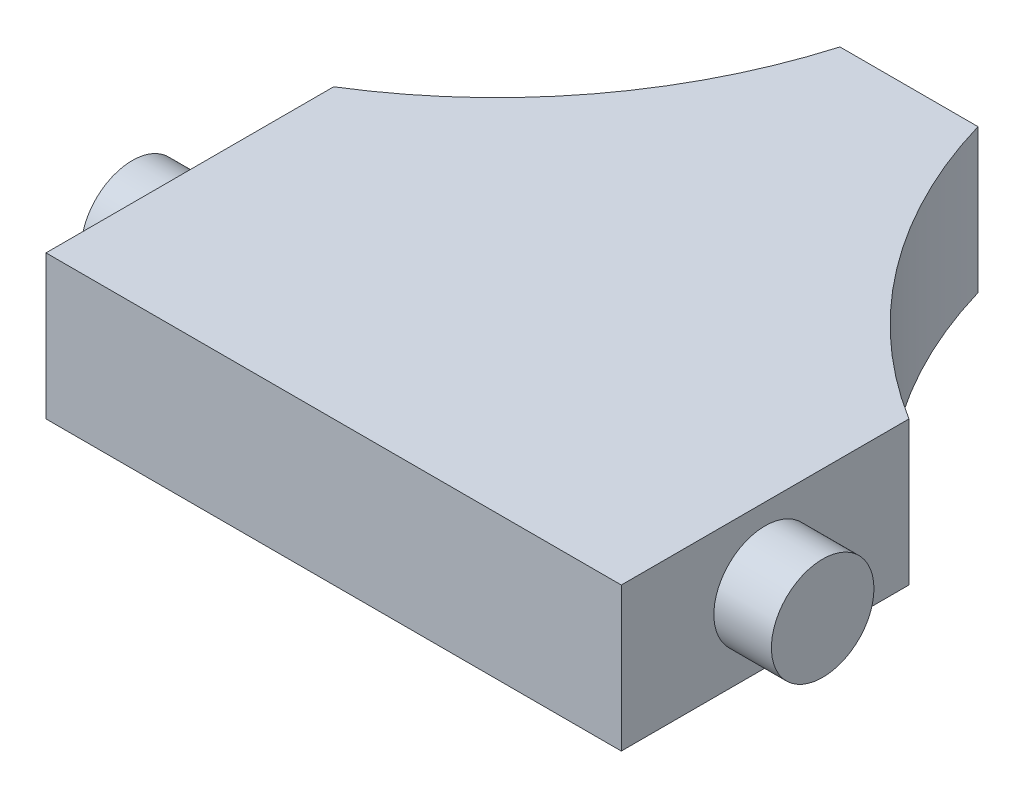
ISO-10303-21;
HEADER;
FILE_DESCRIPTION(('STEP AP214'),'2;1');
FILE_NAME('part.step','',(''),(''),'','','');
FILE_SCHEMA(('AUTOMOTIVE_DESIGN { 1 0 10303 214 1 1 1 1 }'));
ENDSEC;
DATA;
#1=APPLICATION_CONTEXT('core data for automotive mechanical design processes');
#2=APPLICATION_PROTOCOL_DEFINITION('international standard','automotive_design',2000,#1);
#3=PRODUCT_CONTEXT('',#1,'mechanical');
#4=PRODUCT('Part','Part','',(#3));
#5=PRODUCT_RELATED_PRODUCT_CATEGORY('part','',(#4));
#6=PRODUCT_DEFINITION_FORMATION('','',#4);
#7=PRODUCT_DEFINITION_CONTEXT('part definition',#1,'design');
#8=PRODUCT_DEFINITION('design','',#6,#7);
#9=PRODUCT_DEFINITION_SHAPE('','',#8);
#10=(LENGTH_UNIT() NAMED_UNIT(*) SI_UNIT(.MILLI.,.METRE.));
#11=(NAMED_UNIT(*) PLANE_ANGLE_UNIT() SI_UNIT($,.RADIAN.));
#12=(NAMED_UNIT(*) SI_UNIT($,.STERADIAN.) SOLID_ANGLE_UNIT());
#13=UNCERTAINTY_MEASURE_WITH_UNIT(LENGTH_MEASURE(1.E-05),#10,'distance_accuracy_value','');
#14=(GEOMETRIC_REPRESENTATION_CONTEXT(3) GLOBAL_UNCERTAINTY_ASSIGNED_CONTEXT((#13)) GLOBAL_UNIT_ASSIGNED_CONTEXT((#10,
#11,#12)) REPRESENTATION_CONTEXT('',''));
#15=CARTESIAN_POINT('',(0.,0.,0.));
#16=DIRECTION('',(0.,0.,1.));
#17=DIRECTION('',(1.,0.,0.));
#18=AXIS2_PLACEMENT_3D('',#15,#16,#17);
#19=CARTESIAN_POINT('',(96.2895239445508,25.,-74.6200381978586));
#20=DIRECTION('',(0.,-1.,0.));
#21=DIRECTION('',(0.,0.,-1.));
#22=AXIS2_PLACEMENT_3D('',#19,#20,#21);
#23=CYLINDRICAL_SURFACE('',#22,87.8115603304201);
#24=CARTESIAN_POINT('',(96.2895239445508,0.,-74.6200381978586));
#25=DIRECTION('',(0.,1.,0.));
#26=DIRECTION('',(0.,0.,1.));
#27=AXIS2_PLACEMENT_3D('',#24,#25,#26);
#28=CIRCLE('',#27,87.8115603304201);
#29=CARTESIAN_POINT('',(50.,0.,0.));
#30=VERTEX_POINT('',#29);
#31=CARTESIAN_POINT('',(12.,0.,-50.));
#32=VERTEX_POINT('',#31);
#33=EDGE_CURVE('E133',#30,#32,#28,.F.);
#34=ORIENTED_EDGE('',*,*,#33,.T.);
#35=DIRECTION('',(0.,-1.,0.));
#36=VECTOR('',#35,1.);
#37=CARTESIAN_POINT('',(12.,25.,-50.));
#38=LINE('',#37,#36);
#39=CARTESIAN_POINT('',(12.,25.,-50.));
#40=VERTEX_POINT('',#39);
#41=EDGE_CURVE('E79',#40,#32,#38,.T.);
#42=ORIENTED_EDGE('',*,*,#41,.F.);
#43=CARTESIAN_POINT('',(96.2895239445508,25.,-74.6200381978586));
#44=DIRECTION('',(0.,1.,0.));
#45=DIRECTION('',(0.,0.,1.));
#46=AXIS2_PLACEMENT_3D('',#43,#44,#45);
#47=CIRCLE('',#46,87.8115603304201);
#48=CARTESIAN_POINT('',(50.,25.,0.));
#49=VERTEX_POINT('',#48);
#50=EDGE_CURVE('E88',#49,#40,#47,.F.);
#51=ORIENTED_EDGE('',*,*,#50,.F.);
#52=DIRECTION('',(0.,-1.,0.));
#53=VECTOR('',#52,1.);
#54=CARTESIAN_POINT('',(50.,25.,0.));
#55=LINE('',#54,#53);
#56=EDGE_CURVE('E48',#49,#30,#55,.T.);
#57=ORIENTED_EDGE('',*,*,#56,.T.);
#58=EDGE_LOOP('',(#34,#42,#51,#57));
#59=FACE_BOUND('',#58,.T.);
#60=ADVANCED_FACE('F45',(#59),#23,.F.);
#61=CARTESIAN_POINT('',(0.,25.,-50.));
#62=DIRECTION('',(0.,0.,-1.));
#63=DIRECTION('',(-1.,0.,0.));
#64=AXIS2_PLACEMENT_3D('',#61,#62,#63);
#65=PLANE('',#64);
#66=DIRECTION('',(1.,0.,0.));
#67=VECTOR('',#66,1.);
#68=CARTESIAN_POINT('',(0.,0.,-50.));
#69=LINE('',#68,#67);
#70=CARTESIAN_POINT('',(-12.,0.,-50.));
#71=VERTEX_POINT('',#70);
#72=EDGE_CURVE('E137',#71,#32,#69,.T.);
#73=ORIENTED_EDGE('',*,*,#72,.F.);
#74=DIRECTION('',(0.,-1.,0.));
#75=VECTOR('',#74,1.);
#76=CARTESIAN_POINT('',(-12.,25.,-50.));
#77=LINE('',#76,#75);
#78=CARTESIAN_POINT('',(-12.,25.,-50.));
#79=VERTEX_POINT('',#78);
#80=EDGE_CURVE('E83',#79,#71,#77,.T.);
#81=ORIENTED_EDGE('',*,*,#80,.F.);
#82=DIRECTION('',(1.,0.,0.));
#83=VECTOR('',#82,1.);
#84=CARTESIAN_POINT('',(0.,25.,-50.));
#85=LINE('',#84,#83);
#86=EDGE_CURVE('E145',#79,#40,#85,.T.);
#87=ORIENTED_EDGE('',*,*,#86,.T.);
#88=ORIENTED_EDGE('',*,*,#41,.T.);
#89=EDGE_LOOP('',(#73,#81,#87,#88));
#90=FACE_BOUND('',#89,.T.);
#91=ADVANCED_FACE('F179',(#90),#65,.T.);
#92=CARTESIAN_POINT('',(-96.2895239445508,25.,-74.6200381978586));
#93=DIRECTION('',(0.,-1.,0.));
#94=DIRECTION('',(0.,0.,-1.));
#95=AXIS2_PLACEMENT_3D('',#92,#93,#94);
#96=CYLINDRICAL_SURFACE('',#95,87.8115603304201);
#97=CARTESIAN_POINT('',(-96.2895239445508,0.,-74.6200381978586));
#98=DIRECTION('',(0.,1.,0.));
#99=DIRECTION('',(0.,0.,1.));
#100=AXIS2_PLACEMENT_3D('',#97,#98,#99);
#101=CIRCLE('',#100,87.8115603304201);
#102=CARTESIAN_POINT('',(-50.,0.,0.));
#103=VERTEX_POINT('',#102);
#104=EDGE_CURVE('E146',#103,#71,#101,.T.);
#105=ORIENTED_EDGE('',*,*,#104,.F.);
#106=DIRECTION('',(0.,-1.,0.));
#107=VECTOR('',#106,1.);
#108=CARTESIAN_POINT('',(-50.,25.,0.));
#109=LINE('',#108,#107);
#110=CARTESIAN_POINT('',(-50.,25.,0.));
#111=VERTEX_POINT('',#110);
#112=EDGE_CURVE('E63',#111,#103,#109,.T.);
#113=ORIENTED_EDGE('',*,*,#112,.F.);
#114=CARTESIAN_POINT('',(-96.2895239445508,25.,-74.6200381978586));
#115=DIRECTION('',(0.,1.,0.));
#116=DIRECTION('',(0.,0.,1.));
#117=AXIS2_PLACEMENT_3D('',#114,#115,#116);
#118=CIRCLE('',#117,87.8115603304201);
#119=EDGE_CURVE('E149',#111,#79,#118,.T.);
#120=ORIENTED_EDGE('',*,*,#119,.T.);
#121=ORIENTED_EDGE('',*,*,#80,.T.);
#122=EDGE_LOOP('',(#105,#113,#120,#121));
#123=FACE_BOUND('',#122,.T.);
#124=ADVANCED_FACE('F177',(#123),#96,.F.);
#125=CARTESIAN_POINT('',(0.,25.,0.));
#126=DIRECTION('',(0.,1.,0.));
#127=DIRECTION('',(0.,0.,1.));
#128=AXIS2_PLACEMENT_3D('',#125,#126,#127);
#129=PLANE('',#128);
#130=ORIENTED_EDGE('',*,*,#119,.F.);
#131=DIRECTION('',(0.,0.,-1.));
#132=VECTOR('',#131,1.);
#133=CARTESIAN_POINT('',(-50.,25.,50.));
#134=LINE('',#133,#132);
#135=CARTESIAN_POINT('',(-50.,25.,50.));
#136=VERTEX_POINT('',#135);
#137=EDGE_CURVE('E169',#136,#111,#134,.T.);
#138=ORIENTED_EDGE('',*,*,#137,.F.);
#139=DIRECTION('',(-1.,0.,0.));
#140=VECTOR('',#139,1.);
#141=CARTESIAN_POINT('',(-50.,25.,50.));
#142=LINE('',#141,#140);
#143=CARTESIAN_POINT('',(50.,25.,50.));
#144=VERTEX_POINT('',#143);
#145=EDGE_CURVE('E124',#144,#136,#142,.T.);
#146=ORIENTED_EDGE('',*,*,#145,.F.);
#147=DIRECTION('',(0.,0.,-1.));
#148=VECTOR('',#147,1.);
#149=CARTESIAN_POINT('',(50.,25.,50.));
#150=LINE('',#149,#148);
#151=EDGE_CURVE('E139',#144,#49,#150,.T.);
#152=ORIENTED_EDGE('',*,*,#151,.T.);
#153=ORIENTED_EDGE('',*,*,#50,.T.);
#154=ORIENTED_EDGE('',*,*,#86,.F.);
#155=EDGE_LOOP('',(#130,#138,#146,#152,#153,#154));
#156=FACE_BOUND('',#155,.T.);
#157=ADVANCED_FACE('F175',(#156),#129,.T.);
#158=CARTESIAN_POINT('',(0.,0.,0.));
#159=DIRECTION('',(0.,1.,0.));
#160=DIRECTION('',(0.,0.,1.));
#161=AXIS2_PLACEMENT_3D('',#158,#159,#160);
#162=PLANE('',#161);
#163=ORIENTED_EDGE('',*,*,#33,.F.);
#164=DIRECTION('',(0.,0.,-1.));
#165=VECTOR('',#164,1.);
#166=CARTESIAN_POINT('',(50.,0.,50.));
#167=LINE('',#166,#165);
#168=CARTESIAN_POINT('',(50.,0.,50.));
#169=VERTEX_POINT('',#168);
#170=EDGE_CURVE('E114',#169,#30,#167,.T.);
#171=ORIENTED_EDGE('',*,*,#170,.F.);
#172=DIRECTION('',(1.,0.,0.));
#173=VECTOR('',#172,1.);
#174=CARTESIAN_POINT('',(-50.,0.,50.));
#175=LINE('',#174,#173);
#176=CARTESIAN_POINT('',(-50.,0.,50.));
#177=VERTEX_POINT('',#176);
#178=EDGE_CURVE('E106',#177,#169,#175,.T.);
#179=ORIENTED_EDGE('',*,*,#178,.F.);
#180=DIRECTION('',(0.,0.,-1.));
#181=VECTOR('',#180,1.);
#182=CARTESIAN_POINT('',(-50.,0.,50.));
#183=LINE('',#182,#181);
#184=EDGE_CURVE('E112',#177,#103,#183,.T.);
#185=ORIENTED_EDGE('',*,*,#184,.T.);
#186=ORIENTED_EDGE('',*,*,#104,.T.);
#187=ORIENTED_EDGE('',*,*,#72,.T.);
#188=EDGE_LOOP('',(#163,#171,#179,#185,#186,#187));
#189=FACE_BOUND('',#188,.T.);
#190=ADVANCED_FACE('F109',(#189),#162,.F.);
#191=CARTESIAN_POINT('',(-50.,25.,50.));
#192=DIRECTION('',(1.,0.,0.));
#193=DIRECTION('',(0.,0.,-1.));
#194=AXIS2_PLACEMENT_3D('',#191,#192,#193);
#195=PLANE('',#194);
#196=CARTESIAN_POINT('',(-50.,12.5,25.));
#197=DIRECTION('',(1.,0.,0.));
#198=DIRECTION('',(0.,0.,-1.));
#199=AXIS2_PLACEMENT_3D('',#196,#197,#198);
#200=CIRCLE('',#199,8.91289948666999);
#201=CARTESIAN_POINT('',(-50.,12.5,16.08710051333));
#202=VERTEX_POINT('',#201);
#203=EDGE_CURVE('E268',#202,#202,#200,.T.);
#204=ORIENTED_EDGE('',*,*,#203,.T.);
#205=EDGE_LOOP('',(#204));
#206=FACE_BOUND('',#205,.T.);
#207=ORIENTED_EDGE('',*,*,#112,.T.);
#208=ORIENTED_EDGE('',*,*,#184,.F.);
#209=DIRECTION('',(0.,-1.,0.));
#210=VECTOR('',#209,1.);
#211=CARTESIAN_POINT('',(-50.,25.,50.));
#212=LINE('',#211,#210);
#213=EDGE_CURVE('E119',#136,#177,#212,.T.);
#214=ORIENTED_EDGE('',*,*,#213,.F.);
#215=ORIENTED_EDGE('',*,*,#137,.T.);
#216=EDGE_LOOP('',(#207,#208,#214,#215));
#217=FACE_BOUND('',#216,.T.);
#218=ADVANCED_FACE('F131',(#206,#217),#195,.F.);
#219=CARTESIAN_POINT('',(50.,25.,50.));
#220=DIRECTION('',(-1.,0.,0.));
#221=DIRECTION('',(0.,0.,1.));
#222=AXIS2_PLACEMENT_3D('',#219,#220,#221);
#223=PLANE('',#222);
#224=CARTESIAN_POINT('',(50.,12.5,25.));
#225=DIRECTION('',(1.,0.,0.));
#226=DIRECTION('',(0.,0.,-1.));
#227=AXIS2_PLACEMENT_3D('',#224,#225,#226);
#228=CIRCLE('',#227,8.91289948666999);
#229=CARTESIAN_POINT('',(50.,12.5,16.08710051333));
#230=VERTEX_POINT('',#229);
#231=EDGE_CURVE('E11',#230,#230,#228,.T.);
#232=ORIENTED_EDGE('',*,*,#231,.F.);
#233=EDGE_LOOP('',(#232));
#234=FACE_BOUND('',#233,.T.);
#235=ORIENTED_EDGE('',*,*,#56,.F.);
#236=ORIENTED_EDGE('',*,*,#151,.F.);
#237=DIRECTION('',(0.,1.,0.));
#238=VECTOR('',#237,1.);
#239=CARTESIAN_POINT('',(50.,25.,50.));
#240=LINE('',#239,#238);
#241=EDGE_CURVE('E118',#169,#144,#240,.T.);
#242=ORIENTED_EDGE('',*,*,#241,.F.);
#243=ORIENTED_EDGE('',*,*,#170,.T.);
#244=EDGE_LOOP('',(#235,#236,#242,#243));
#245=FACE_BOUND('',#244,.T.);
#246=ADVANCED_FACE('F165',(#234,#245),#223,.F.);
#247=CARTESIAN_POINT('',(0.,0.,50.));
#248=DIRECTION('',(0.,0.,1.));
#249=DIRECTION('',(1.,0.,0.));
#250=AXIS2_PLACEMENT_3D('',#247,#248,#249);
#251=PLANE('',#250);
#252=ORIENTED_EDGE('',*,*,#213,.T.);
#253=ORIENTED_EDGE('',*,*,#178,.T.);
#254=ORIENTED_EDGE('',*,*,#241,.T.);
#255=ORIENTED_EDGE('',*,*,#145,.T.);
#256=EDGE_LOOP('',(#252,#253,#254,#255));
#257=FACE_BOUND('',#256,.T.);
#258=ADVANCED_FACE('F122',(#257),#251,.T.);
#259=CARTESIAN_POINT('',(60.,12.5,25.));
#260=DIRECTION('',(-1.,0.,0.));
#261=DIRECTION('',(0.,0.,1.));
#262=AXIS2_PLACEMENT_3D('',#259,#260,#261);
#263=CYLINDRICAL_SURFACE('',#262,8.91289948666999);
#264=CARTESIAN_POINT('',(60.,12.5,25.));
#265=DIRECTION('',(1.,0.,0.));
#266=DIRECTION('',(0.,0.,-1.));
#267=AXIS2_PLACEMENT_3D('',#264,#265,#266);
#268=CIRCLE('',#267,8.91289948666999);
#269=CARTESIAN_POINT('',(60.,12.5,16.08710051333));
#270=VERTEX_POINT('',#269);
#271=EDGE_CURVE('E129',#270,#270,#268,.T.);
#272=ORIENTED_EDGE('',*,*,#271,.F.);
#273=EDGE_LOOP('',(#272));
#274=FACE_BOUND('',#273,.T.);
#275=ORIENTED_EDGE('',*,*,#231,.T.);
#276=EDGE_LOOP('',(#275));
#277=FACE_BOUND('',#276,.T.);
#278=ADVANCED_FACE('F234',(#274,#277),#263,.T.);
#279=CARTESIAN_POINT('',(60.,12.5,25.));
#280=DIRECTION('',(1.,0.,0.));
#281=DIRECTION('',(0.,0.,-1.));
#282=AXIS2_PLACEMENT_3D('',#279,#280,#281);
#283=PLANE('',#282);
#284=ORIENTED_EDGE('',*,*,#271,.T.);
#285=EDGE_LOOP('',(#284));
#286=FACE_BOUND('',#285,.T.);
#287=ADVANCED_FACE('F240',(#286),#283,.T.);
#288=CARTESIAN_POINT('',(-60.,12.5,25.));
#289=DIRECTION('',(1.,0.,0.));
#290=DIRECTION('',(0.,0.,-1.));
#291=AXIS2_PLACEMENT_3D('',#288,#289,#290);
#292=CYLINDRICAL_SURFACE('',#291,8.91289948666999);
#293=CARTESIAN_POINT('',(-60.,12.5,25.));
#294=DIRECTION('',(1.,0.,0.));
#295=DIRECTION('',(0.,0.,-1.));
#296=AXIS2_PLACEMENT_3D('',#293,#294,#295);
#297=CIRCLE('',#296,8.91289948666999);
#298=CARTESIAN_POINT('',(-60.,12.5,16.08710051333));
#299=VERTEX_POINT('',#298);
#300=EDGE_CURVE('E266',#299,#299,#297,.T.);
#301=ORIENTED_EDGE('',*,*,#300,.T.);
#302=EDGE_LOOP('',(#301));
#303=FACE_BOUND('',#302,.T.);
#304=ORIENTED_EDGE('',*,*,#203,.F.);
#305=EDGE_LOOP('',(#304));
#306=FACE_BOUND('',#305,.T.);
#307=ADVANCED_FACE('F247',(#303,#306),#292,.T.);
#308=CARTESIAN_POINT('',(-60.,12.5,25.));
#309=DIRECTION('',(-1.,0.,0.));
#310=DIRECTION('',(0.,0.,-1.));
#311=AXIS2_PLACEMENT_3D('',#308,#309,#310);
#312=PLANE('',#311);
#313=ORIENTED_EDGE('',*,*,#300,.F.);
#314=EDGE_LOOP('',(#313));
#315=FACE_BOUND('',#314,.T.);
#316=ADVANCED_FACE('F254',(#315),#312,.T.);
#317=CLOSED_SHELL('',(#60,#91,#124,#157,#190,#218,#246,#258,#278,#287,#307,#316));
#318=MANIFOLD_SOLID_BREP('B2',#317);
#319=ADVANCED_BREP_SHAPE_REPRESENTATION('',(#18,#318),#14);
#320=SHAPE_DEFINITION_REPRESENTATION(#9,#319);
ENDSEC;
END-ISO-10303-21;
